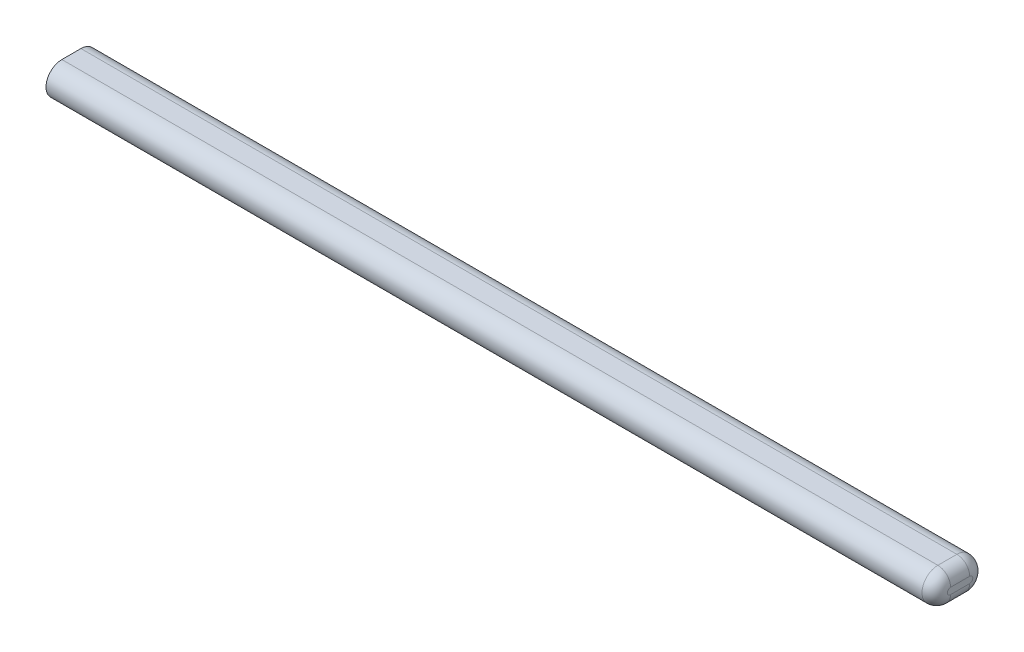
ISO-10303-21;
HEADER;
FILE_DESCRIPTION(('STEP AP214'),'2;1');
FILE_NAME('part.step','',(''),(''),'','','');
FILE_SCHEMA(('AUTOMOTIVE_DESIGN { 1 0 10303 214 1 1 1 1 }'));
ENDSEC;
DATA;
#1=APPLICATION_CONTEXT('core data for automotive mechanical design processes');
#2=APPLICATION_PROTOCOL_DEFINITION('international standard','automotive_design',2000,#1);
#3=PRODUCT_CONTEXT('',#1,'mechanical');
#4=PRODUCT('Part','Part','',(#3));
#5=PRODUCT_RELATED_PRODUCT_CATEGORY('part','',(#4));
#6=PRODUCT_DEFINITION_FORMATION('','',#4);
#7=PRODUCT_DEFINITION_CONTEXT('part definition',#1,'design');
#8=PRODUCT_DEFINITION('design','',#6,#7);
#9=PRODUCT_DEFINITION_SHAPE('','',#8);
#10=(LENGTH_UNIT() NAMED_UNIT(*) SI_UNIT(.MILLI.,.METRE.));
#11=(NAMED_UNIT(*) PLANE_ANGLE_UNIT() SI_UNIT($,.RADIAN.));
#12=(NAMED_UNIT(*) SI_UNIT($,.STERADIAN.) SOLID_ANGLE_UNIT());
#13=UNCERTAINTY_MEASURE_WITH_UNIT(LENGTH_MEASURE(1.E-05),#10,'distance_accuracy_value','');
#14=(GEOMETRIC_REPRESENTATION_CONTEXT(3) GLOBAL_UNCERTAINTY_ASSIGNED_CONTEXT((#13)) GLOBAL_UNIT_ASSIGNED_CONTEXT((#10,
#11,#12)) REPRESENTATION_CONTEXT('',''));
#15=CARTESIAN_POINT('',(0.,0.,0.));
#16=DIRECTION('',(0.,0.,1.));
#17=DIRECTION('',(1.,0.,0.));
#18=AXIS2_PLACEMENT_3D('',#15,#16,#17);
#19=CARTESIAN_POINT('',(700.,0.,7.5));
#20=DIRECTION('',(-1.,0.,0.));
#21=DIRECTION('',(0.,0.,1.));
#22=AXIS2_PLACEMENT_3D('',#19,#20,#21);
#23=CYLINDRICAL_SURFACE('',#22,12.5);
#24=DIRECTION('',(-1.,0.,0.));
#25=VECTOR('',#24,1.);
#26=CARTESIAN_POINT('',(700.,-12.5,7.5));
#27=LINE('',#26,#25);
#28=CARTESIAN_POINT('',(690.,-12.5,7.5));
#29=VERTEX_POINT('',#28);
#30=CARTESIAN_POINT('',(0.,-12.5,7.5));
#31=VERTEX_POINT('',#30);
#32=EDGE_CURVE('E92',#29,#31,#27,.T.);
#33=ORIENTED_EDGE('',*,*,#32,.F.);
#34=CARTESIAN_POINT('',(690.,0.,7.5));
#35=DIRECTION('',(1.,0.,0.));
#36=DIRECTION('',(0.,0.,-1.));
#37=AXIS2_PLACEMENT_3D('',#34,#35,#36);
#38=CIRCLE('',#37,12.5);
#39=CARTESIAN_POINT('',(690.,12.5,7.5));
#40=VERTEX_POINT('',#39);
#41=EDGE_CURVE('E11',#29,#40,#38,.F.);
#42=ORIENTED_EDGE('',*,*,#41,.T.);
#43=DIRECTION('',(-1.,0.,0.));
#44=VECTOR('',#43,1.);
#45=CARTESIAN_POINT('',(700.,12.5,7.5));
#46=LINE('',#45,#44);
#47=CARTESIAN_POINT('',(0.,12.5,7.5));
#48=VERTEX_POINT('',#47);
#49=EDGE_CURVE('E114',#40,#48,#46,.T.);
#50=ORIENTED_EDGE('',*,*,#49,.T.);
#51=CARTESIAN_POINT('',(0.,0.,7.5));
#52=DIRECTION('',(1.,0.,0.));
#53=DIRECTION('',(0.,0.,-1.));
#54=AXIS2_PLACEMENT_3D('',#51,#52,#53);
#55=CIRCLE('',#54,12.5);
#56=EDGE_CURVE('E108',#48,#31,#55,.T.);
#57=ORIENTED_EDGE('',*,*,#56,.T.);
#58=EDGE_LOOP('',(#33,#42,#50,#57));
#59=FACE_BOUND('',#58,.T.);
#60=ADVANCED_FACE('F39',(#59),#23,.T.);
#61=CARTESIAN_POINT('',(700.,-12.5,7.5));
#62=DIRECTION('',(0.,1.,0.));
#63=DIRECTION('',(0.,0.,1.));
#64=AXIS2_PLACEMENT_3D('',#61,#62,#63);
#65=PLANE('',#64);
#66=DIRECTION('',(-1.,0.,0.));
#67=VECTOR('',#66,1.);
#68=CARTESIAN_POINT('',(700.,-12.5,-7.5));
#69=LINE('',#68,#67);
#70=CARTESIAN_POINT('',(690.,-12.5,-7.5));
#71=VERTEX_POINT('',#70);
#72=CARTESIAN_POINT('',(0.,-12.5,-7.5));
#73=VERTEX_POINT('',#72);
#74=EDGE_CURVE('E102',#71,#73,#69,.T.);
#75=ORIENTED_EDGE('',*,*,#74,.F.);
#76=DIRECTION('',(0.,0.,-1.));
#77=VECTOR('',#76,1.);
#78=CARTESIAN_POINT('',(690.,-12.5,7.5));
#79=LINE('',#78,#77);
#80=EDGE_CURVE('E49',#71,#29,#79,.F.);
#81=ORIENTED_EDGE('',*,*,#80,.T.);
#82=ORIENTED_EDGE('',*,*,#32,.T.);
#83=DIRECTION('',(0.,0.,-1.));
#84=VECTOR('',#83,1.);
#85=CARTESIAN_POINT('',(0.,-12.5,7.5));
#86=LINE('',#85,#84);
#87=EDGE_CURVE('E95',#31,#73,#86,.T.);
#88=ORIENTED_EDGE('',*,*,#87,.T.);
#89=EDGE_LOOP('',(#75,#81,#82,#88));
#90=FACE_BOUND('',#89,.T.);
#91=ADVANCED_FACE('F94',(#90),#65,.F.);
#92=CARTESIAN_POINT('',(700.,0.,-7.5));
#93=DIRECTION('',(-1.,0.,0.));
#94=DIRECTION('',(0.,0.,1.));
#95=AXIS2_PLACEMENT_3D('',#92,#93,#94);
#96=CYLINDRICAL_SURFACE('',#95,12.5);
#97=DIRECTION('',(-1.,0.,0.));
#98=VECTOR('',#97,1.);
#99=CARTESIAN_POINT('',(700.,12.5,-7.5));
#100=LINE('',#99,#98);
#101=CARTESIAN_POINT('',(690.,12.5,-7.5));
#102=VERTEX_POINT('',#101);
#103=CARTESIAN_POINT('',(0.,12.5,-7.5));
#104=VERTEX_POINT('',#103);
#105=EDGE_CURVE('E129',#102,#104,#100,.T.);
#106=ORIENTED_EDGE('',*,*,#105,.F.);
#107=CARTESIAN_POINT('',(690.,0.,-7.5));
#108=DIRECTION('',(1.,0.,0.));
#109=DIRECTION('',(0.,0.,-1.));
#110=AXIS2_PLACEMENT_3D('',#107,#108,#109);
#111=CIRCLE('',#110,12.5);
#112=EDGE_CURVE('E64',#102,#71,#111,.F.);
#113=ORIENTED_EDGE('',*,*,#112,.T.);
#114=ORIENTED_EDGE('',*,*,#74,.T.);
#115=CARTESIAN_POINT('',(0.,0.,-7.5));
#116=DIRECTION('',(1.,0.,0.));
#117=DIRECTION('',(0.,0.,1.));
#118=AXIS2_PLACEMENT_3D('',#115,#116,#117);
#119=CIRCLE('',#118,12.5);
#120=EDGE_CURVE('E110',#73,#104,#119,.T.);
#121=ORIENTED_EDGE('',*,*,#120,.T.);
#122=EDGE_LOOP('',(#106,#113,#114,#121));
#123=FACE_BOUND('',#122,.T.);
#124=ADVANCED_FACE('F179',(#123),#96,.T.);
#125=CARTESIAN_POINT('',(700.,12.5,-7.5));
#126=DIRECTION('',(0.,-1.,0.));
#127=DIRECTION('',(0.,0.,-1.));
#128=AXIS2_PLACEMENT_3D('',#125,#126,#127);
#129=PLANE('',#128);
#130=ORIENTED_EDGE('',*,*,#49,.F.);
#131=DIRECTION('',(0.,0.,1.));
#132=VECTOR('',#131,1.);
#133=CARTESIAN_POINT('',(690.,12.5,-7.5));
#134=LINE('',#133,#132);
#135=EDGE_CURVE('E146',#40,#102,#134,.F.);
#136=ORIENTED_EDGE('',*,*,#135,.T.);
#137=ORIENTED_EDGE('',*,*,#105,.T.);
#138=DIRECTION('',(0.,0.,1.));
#139=VECTOR('',#138,1.);
#140=CARTESIAN_POINT('',(0.,12.5,-7.5));
#141=LINE('',#140,#139);
#142=EDGE_CURVE('E124',#104,#48,#141,.T.);
#143=ORIENTED_EDGE('',*,*,#142,.T.);
#144=EDGE_LOOP('',(#130,#136,#137,#143));
#145=FACE_BOUND('',#144,.T.);
#146=ADVANCED_FACE('F178',(#145),#129,.F.);
#147=CARTESIAN_POINT('',(700.,0.,7.5));
#148=DIRECTION('',(1.,0.,0.));
#149=DIRECTION('',(0.,0.,-1.));
#150=AXIS2_PLACEMENT_3D('',#147,#148,#149);
#151=PLANE('',#150);
#152=CARTESIAN_POINT('',(700.,0.,-7.5));
#153=DIRECTION('',(1.,0.,0.));
#154=DIRECTION('',(0.,0.,-1.));
#155=AXIS2_PLACEMENT_3D('',#152,#153,#154);
#156=CIRCLE('',#155,2.5);
#157=CARTESIAN_POINT('',(700.,-2.5,-7.5));
#158=VERTEX_POINT('',#157);
#159=CARTESIAN_POINT('',(700.,2.50000000000001,-7.5));
#160=VERTEX_POINT('',#159);
#161=EDGE_CURVE('E139',#158,#160,#156,.T.);
#162=ORIENTED_EDGE('',*,*,#161,.T.);
#163=DIRECTION('',(0.,0.,1.));
#164=VECTOR('',#163,1.);
#165=CARTESIAN_POINT('',(700.,2.5,7.5));
#166=LINE('',#165,#164);
#167=CARTESIAN_POINT('',(700.,2.5,7.5));
#168=VERTEX_POINT('',#167);
#169=EDGE_CURVE('E142',#160,#168,#166,.T.);
#170=ORIENTED_EDGE('',*,*,#169,.T.);
#171=CARTESIAN_POINT('',(700.,0.,7.5));
#172=DIRECTION('',(1.,0.,0.));
#173=DIRECTION('',(0.,0.,-1.));
#174=AXIS2_PLACEMENT_3D('',#171,#172,#173);
#175=CIRCLE('',#174,2.5);
#176=CARTESIAN_POINT('',(700.,-2.5,7.5));
#177=VERTEX_POINT('',#176);
#178=EDGE_CURVE('E101',#168,#177,#175,.T.);
#179=ORIENTED_EDGE('',*,*,#178,.T.);
#180=DIRECTION('',(0.,0.,-1.));
#181=VECTOR('',#180,1.);
#182=CARTESIAN_POINT('',(700.,-2.5,-7.5));
#183=LINE('',#182,#181);
#184=EDGE_CURVE('E136',#177,#158,#183,.T.);
#185=ORIENTED_EDGE('',*,*,#184,.T.);
#186=EDGE_LOOP('',(#162,#170,#179,#185));
#187=FACE_BOUND('',#186,.T.);
#188=ADVANCED_FACE('F171',(#187),#151,.T.);
#189=CARTESIAN_POINT('',(0.,0.,7.5));
#190=DIRECTION('',(1.,0.,0.));
#191=DIRECTION('',(0.,0.,-1.));
#192=AXIS2_PLACEMENT_3D('',#189,#190,#191);
#193=PLANE('',#192);
#194=ORIENTED_EDGE('',*,*,#56,.F.);
#195=ORIENTED_EDGE('',*,*,#142,.F.);
#196=ORIENTED_EDGE('',*,*,#120,.F.);
#197=ORIENTED_EDGE('',*,*,#87,.F.);
#198=EDGE_LOOP('',(#194,#195,#196,#197));
#199=FACE_BOUND('',#198,.T.);
#200=ADVANCED_FACE('F106',(#199),#193,.F.);
#201=CARTESIAN_POINT('',(690.,-2.5,7.5));
#202=DIRECTION('',(0.,0.,1.));
#203=DIRECTION('',(1.,0.,0.));
#204=AXIS2_PLACEMENT_3D('',#201,#202,#203);
#205=CYLINDRICAL_SURFACE('',#204,10.);
#206=CARTESIAN_POINT('',(690.,-2.5,7.5));
#207=DIRECTION('',(0.,0.,1.));
#208=DIRECTION('',(1.,0.,0.));
#209=AXIS2_PLACEMENT_3D('',#206,#207,#208);
#210=CIRCLE('',#209,10.);
#211=EDGE_CURVE('E120',#29,#177,#210,.T.);
#212=ORIENTED_EDGE('',*,*,#211,.F.);
#213=ORIENTED_EDGE('',*,*,#80,.F.);
#214=CARTESIAN_POINT('',(690.,-2.5,-7.5));
#215=DIRECTION('',(0.,0.,-1.));
#216=DIRECTION('',(-1.,0.,0.));
#217=AXIS2_PLACEMENT_3D('',#214,#215,#216);
#218=CIRCLE('',#217,10.);
#219=EDGE_CURVE('E43',#158,#71,#218,.T.);
#220=ORIENTED_EDGE('',*,*,#219,.F.);
#221=ORIENTED_EDGE('',*,*,#184,.F.);
#222=EDGE_LOOP('',(#212,#213,#220,#221));
#223=FACE_BOUND('',#222,.T.);
#224=ADVANCED_FACE('F41',(#223),#205,.T.);
#225=CARTESIAN_POINT('',(690.,0.,-7.5));
#226=DIRECTION('',(1.,0.,0.));
#227=DIRECTION('',(0.,0.,-1.));
#228=AXIS2_PLACEMENT_3D('',#225,#226,#227);
#229=DEGENERATE_TOROIDAL_SURFACE('',#228,2.5,10.,.T.);
#230=ORIENTED_EDGE('',*,*,#219,.T.);
#231=ORIENTED_EDGE('',*,*,#112,.F.);
#232=CARTESIAN_POINT('',(690.,2.50000000000001,-7.5));
#233=DIRECTION('',(0.,0.,1.));
#234=DIRECTION('',(0.,-1.,0.));
#235=AXIS2_PLACEMENT_3D('',#232,#233,#234);
#236=CIRCLE('',#235,10.);
#237=EDGE_CURVE('E157',#160,#102,#236,.T.);
#238=ORIENTED_EDGE('',*,*,#237,.F.);
#239=ORIENTED_EDGE('',*,*,#161,.F.);
#240=EDGE_LOOP('',(#230,#231,#238,#239));
#241=FACE_BOUND('',#240,.T.);
#242=ADVANCED_FACE('F196',(#241),#229,.T.);
#243=CARTESIAN_POINT('',(690.,0.,7.5));
#244=DIRECTION('',(1.,0.,0.));
#245=DIRECTION('',(0.,0.,-1.));
#246=AXIS2_PLACEMENT_3D('',#243,#244,#245);
#247=DEGENERATE_TOROIDAL_SURFACE('',#246,2.5,10.,.T.);
#248=ORIENTED_EDGE('',*,*,#211,.T.);
#249=ORIENTED_EDGE('',*,*,#178,.F.);
#250=CARTESIAN_POINT('',(690.,2.5,7.5));
#251=DIRECTION('',(0.,0.,-1.));
#252=DIRECTION('',(-1.,0.,0.));
#253=AXIS2_PLACEMENT_3D('',#250,#251,#252);
#254=CIRCLE('',#253,10.);
#255=EDGE_CURVE('E154',#40,#168,#254,.T.);
#256=ORIENTED_EDGE('',*,*,#255,.F.);
#257=ORIENTED_EDGE('',*,*,#41,.F.);
#258=EDGE_LOOP('',(#248,#249,#256,#257));
#259=FACE_BOUND('',#258,.T.);
#260=ADVANCED_FACE('F164',(#259),#247,.T.);
#261=CARTESIAN_POINT('',(690.,2.5,7.5));
#262=DIRECTION('',(0.,0.,-1.));
#263=DIRECTION('',(0.,1.,0.));
#264=AXIS2_PLACEMENT_3D('',#261,#262,#263);
#265=CYLINDRICAL_SURFACE('',#264,10.);
#266=ORIENTED_EDGE('',*,*,#237,.T.);
#267=ORIENTED_EDGE('',*,*,#135,.F.);
#268=ORIENTED_EDGE('',*,*,#255,.T.);
#269=ORIENTED_EDGE('',*,*,#169,.F.);
#270=EDGE_LOOP('',(#266,#267,#268,#269));
#271=FACE_BOUND('',#270,.T.);
#272=ADVANCED_FACE('F175',(#271),#265,.T.);
#273=CLOSED_SHELL('',(#60,#91,#124,#146,#188,#200,#224,#242,#260,#272));
#274=MANIFOLD_SOLID_BREP('B2',#273);
#275=ADVANCED_BREP_SHAPE_REPRESENTATION('',(#18,#274),#14);
#276=SHAPE_DEFINITION_REPRESENTATION(#9,#275);
ENDSEC;
END-ISO-10303-21;
